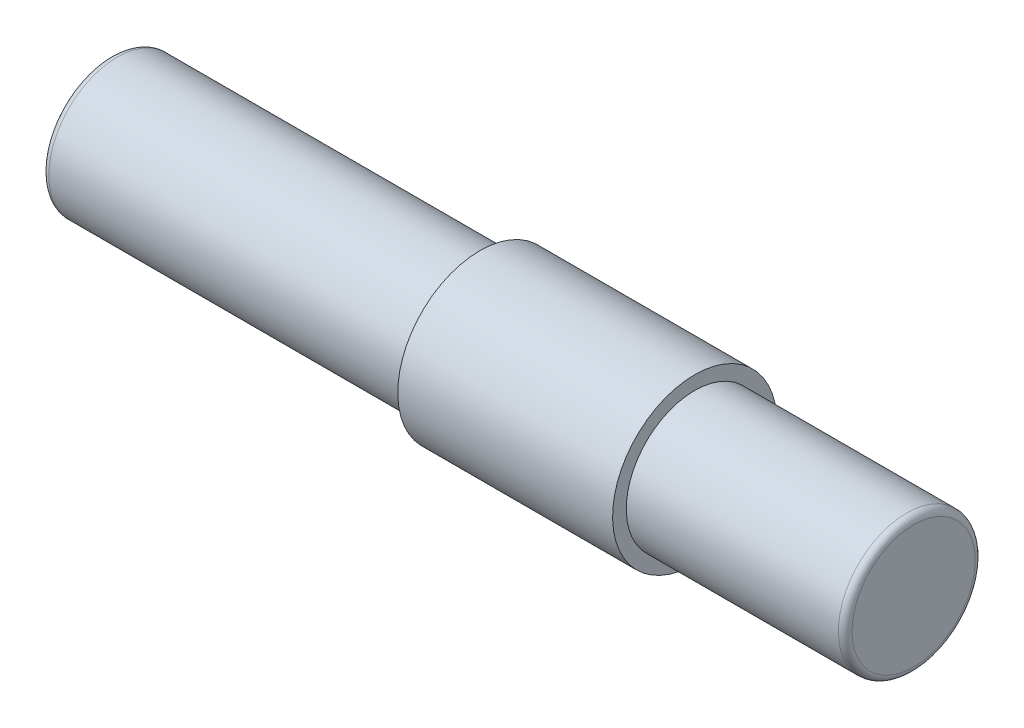
ISO-10303-21;
HEADER;
FILE_DESCRIPTION(('STEP AP214'),'2;1');
FILE_NAME('part.step','',(''),(''),'','','');
FILE_SCHEMA(('AUTOMOTIVE_DESIGN { 1 0 10303 214 1 1 1 1 }'));
ENDSEC;
DATA;
#1=APPLICATION_CONTEXT('core data for automotive mechanical design processes');
#2=APPLICATION_PROTOCOL_DEFINITION('international standard','automotive_design',2000,#1);
#3=PRODUCT_CONTEXT('',#1,'mechanical');
#4=PRODUCT('Part','Part','',(#3));
#5=PRODUCT_RELATED_PRODUCT_CATEGORY('part','',(#4));
#6=PRODUCT_DEFINITION_FORMATION('','',#4);
#7=PRODUCT_DEFINITION_CONTEXT('part definition',#1,'design');
#8=PRODUCT_DEFINITION('design','',#6,#7);
#9=PRODUCT_DEFINITION_SHAPE('','',#8);
#10=(LENGTH_UNIT() NAMED_UNIT(*) SI_UNIT(.MILLI.,.METRE.));
#11=(NAMED_UNIT(*) PLANE_ANGLE_UNIT() SI_UNIT($,.RADIAN.));
#12=(NAMED_UNIT(*) SI_UNIT($,.STERADIAN.) SOLID_ANGLE_UNIT());
#13=UNCERTAINTY_MEASURE_WITH_UNIT(LENGTH_MEASURE(1.E-05),#10,'distance_accuracy_value','');
#14=(GEOMETRIC_REPRESENTATION_CONTEXT(3) GLOBAL_UNCERTAINTY_ASSIGNED_CONTEXT((#13)) GLOBAL_UNIT_ASSIGNED_CONTEXT((#10,
#11,#12)) REPRESENTATION_CONTEXT('',''));
#15=CARTESIAN_POINT('',(0.,0.,0.));
#16=DIRECTION('',(0.,0.,1.));
#17=DIRECTION('',(1.,0.,0.));
#18=AXIS2_PLACEMENT_3D('',#15,#16,#17);
#19=CARTESIAN_POINT('',(-78.7780779732345,1.7543788122043,0.));
#20=DIRECTION('',(-1.,0.,0.));
#21=DIRECTION('',(0.,-1.,0.));
#22=AXIS2_PLACEMENT_3D('',#19,#20,#21);
#23=PLANE('',#22);
#24=CARTESIAN_POINT('',(-78.7780779732345,1.7543788122043,0.));
#25=DIRECTION('',(-1.,0.,0.));
#26=DIRECTION('',(0.,-1.,0.));
#27=AXIS2_PLACEMENT_3D('',#24,#25,#26);
#28=CIRCLE('',#27,4.5);
#29=CARTESIAN_POINT('',(-78.7780779732345,-2.74562118779569,0.));
#30=VERTEX_POINT('',#29);
#31=EDGE_CURVE('E10',#30,#30,#28,.T.);
#32=ORIENTED_EDGE('',*,*,#31,.T.);
#33=EDGE_LOOP('',(#32));
#34=FACE_BOUND('',#33,.T.);
#35=ADVANCED_FACE('F32',(#34),#23,.T.);
#36=CARTESIAN_POINT('',(-20.0780779732345,1.75437881220431,0.));
#37=DIRECTION('',(1.,0.,0.));
#38=DIRECTION('',(0.,1.,0.));
#39=AXIS2_PLACEMENT_3D('',#36,#37,#38);
#40=CYLINDRICAL_SURFACE('',#39,5.);
#41=CARTESIAN_POINT('',(-78.2780779732345,1.7543788122043,0.));
#42=DIRECTION('',(-1.,0.,0.));
#43=DIRECTION('',(0.,-1.,0.));
#44=AXIS2_PLACEMENT_3D('',#41,#42,#43);
#45=CIRCLE('',#44,5.);
#46=CARTESIAN_POINT('',(-78.2780779732345,-3.24562118779569,0.));
#47=VERTEX_POINT('',#46);
#48=EDGE_CURVE('E39',#47,#47,#45,.F.);
#49=ORIENTED_EDGE('',*,*,#48,.T.);
#50=EDGE_LOOP('',(#49));
#51=FACE_BOUND('',#50,.T.);
#52=CARTESIAN_POINT('',(-51.7780779732345,1.75437881220431,0.));
#53=DIRECTION('',(1.,0.,0.));
#54=DIRECTION('',(0.,1.,0.));
#55=AXIS2_PLACEMENT_3D('',#52,#53,#54);
#56=CIRCLE('',#55,5.);
#57=CARTESIAN_POINT('',(-51.7780779732345,6.7543788122043,0.));
#58=VERTEX_POINT('',#57);
#59=EDGE_CURVE('E52',#58,#58,#56,.T.);
#60=ORIENTED_EDGE('',*,*,#59,.F.);
#61=EDGE_LOOP('',(#60));
#62=FACE_BOUND('',#61,.T.);
#63=ADVANCED_FACE('F83',(#51,#62),#40,.T.);
#64=CARTESIAN_POINT('',(-51.7780779732345,6.7543788122043,0.));
#65=DIRECTION('',(-1.,0.,0.));
#66=DIRECTION('',(0.,-1.,0.));
#67=AXIS2_PLACEMENT_3D('',#64,#65,#66);
#68=PLANE('',#67);
#69=ORIENTED_EDGE('',*,*,#59,.T.);
#70=EDGE_LOOP('',(#69));
#71=FACE_BOUND('',#70,.T.);
#72=CARTESIAN_POINT('',(-51.7780779732345,1.75437881220431,0.));
#73=DIRECTION('',(1.,0.,0.));
#74=DIRECTION('',(0.,1.,0.));
#75=AXIS2_PLACEMENT_3D('',#72,#73,#74);
#76=CIRCLE('',#75,6.);
#77=CARTESIAN_POINT('',(-51.7780779732345,7.75437881220431,0.));
#78=VERTEX_POINT('',#77);
#79=EDGE_CURVE('E55',#78,#78,#76,.T.);
#80=ORIENTED_EDGE('',*,*,#79,.F.);
#81=EDGE_LOOP('',(#80));
#82=FACE_BOUND('',#81,.T.);
#83=ADVANCED_FACE('F79',(#71,#82),#68,.T.);
#84=CARTESIAN_POINT('',(-20.0780779732345,1.75437881220431,0.));
#85=DIRECTION('',(1.,0.,0.));
#86=DIRECTION('',(0.,1.,0.));
#87=AXIS2_PLACEMENT_3D('',#84,#85,#86);
#88=CYLINDRICAL_SURFACE('',#87,6.);
#89=ORIENTED_EDGE('',*,*,#79,.T.);
#90=EDGE_LOOP('',(#89));
#91=FACE_BOUND('',#90,.T.);
#92=CARTESIAN_POINT('',(-36.0780779732345,1.75437881220431,0.));
#93=DIRECTION('',(1.,0.,0.));
#94=DIRECTION('',(0.,1.,0.));
#95=AXIS2_PLACEMENT_3D('',#92,#93,#94);
#96=CIRCLE('',#95,6.);
#97=CARTESIAN_POINT('',(-36.0780779732345,7.75437881220431,0.));
#98=VERTEX_POINT('',#97);
#99=EDGE_CURVE('E58',#98,#98,#96,.T.);
#100=ORIENTED_EDGE('',*,*,#99,.F.);
#101=EDGE_LOOP('',(#100));
#102=FACE_BOUND('',#101,.T.);
#103=ADVANCED_FACE('F69',(#91,#102),#88,.T.);
#104=CARTESIAN_POINT('',(-36.0780779732345,7.75437881220431,0.));
#105=DIRECTION('',(1.,0.,0.));
#106=DIRECTION('',(0.,1.,0.));
#107=AXIS2_PLACEMENT_3D('',#104,#105,#106);
#108=PLANE('',#107);
#109=ORIENTED_EDGE('',*,*,#99,.T.);
#110=EDGE_LOOP('',(#109));
#111=FACE_BOUND('',#110,.T.);
#112=CARTESIAN_POINT('',(-36.0780779732345,1.75437881220431,0.));
#113=DIRECTION('',(1.,0.,0.));
#114=DIRECTION('',(0.,1.,0.));
#115=AXIS2_PLACEMENT_3D('',#112,#113,#114);
#116=CIRCLE('',#115,5.);
#117=CARTESIAN_POINT('',(-36.0780779732345,6.75437881220431,0.));
#118=VERTEX_POINT('',#117);
#119=EDGE_CURVE('E61',#118,#118,#116,.T.);
#120=ORIENTED_EDGE('',*,*,#119,.F.);
#121=EDGE_LOOP('',(#120));
#122=FACE_BOUND('',#121,.T.);
#123=ADVANCED_FACE('F67',(#111,#122),#108,.T.);
#124=CARTESIAN_POINT('',(-20.0780779732345,1.75437881220431,0.));
#125=DIRECTION('',(1.,0.,0.));
#126=DIRECTION('',(0.,1.,0.));
#127=AXIS2_PLACEMENT_3D('',#124,#125,#126);
#128=CYLINDRICAL_SURFACE('',#127,4.99999999999999);
#129=CARTESIAN_POINT('',(-20.5780779732345,1.75437881220431,0.));
#130=DIRECTION('',(1.,0.,0.));
#131=DIRECTION('',(0.,1.,0.));
#132=AXIS2_PLACEMENT_3D('',#129,#130,#131);
#133=CIRCLE('',#132,4.99999999999999);
#134=CARTESIAN_POINT('',(-20.5780779732345,6.7543788122043,0.));
#135=VERTEX_POINT('',#134);
#136=EDGE_CURVE('E43',#135,#135,#133,.F.);
#137=ORIENTED_EDGE('',*,*,#136,.T.);
#138=EDGE_LOOP('',(#137));
#139=FACE_BOUND('',#138,.T.);
#140=ORIENTED_EDGE('',*,*,#119,.T.);
#141=EDGE_LOOP('',(#140));
#142=FACE_BOUND('',#141,.T.);
#143=ADVANCED_FACE('F65',(#139,#142),#128,.T.);
#144=CARTESIAN_POINT('',(-20.0780779732345,6.75437881220431,0.));
#145=DIRECTION('',(1.,0.,0.));
#146=DIRECTION('',(0.,1.,0.));
#147=AXIS2_PLACEMENT_3D('',#144,#145,#146);
#148=PLANE('',#147);
#149=CARTESIAN_POINT('',(-20.0780779732345,1.75437881220431,0.));
#150=DIRECTION('',(1.,0.,0.));
#151=DIRECTION('',(0.,1.,0.));
#152=AXIS2_PLACEMENT_3D('',#149,#150,#151);
#153=CIRCLE('',#152,4.49999999999999);
#154=CARTESIAN_POINT('',(-20.0780779732345,6.2543788122043,0.));
#155=VERTEX_POINT('',#154);
#156=EDGE_CURVE('E47',#155,#155,#153,.T.);
#157=ORIENTED_EDGE('',*,*,#156,.T.);
#158=EDGE_LOOP('',(#157));
#159=FACE_BOUND('',#158,.T.);
#160=ADVANCED_FACE('F76',(#159),#148,.T.);
#161=CARTESIAN_POINT('',(-20.5780779732345,1.75437881220431,0.));
#162=DIRECTION('',(1.,0.,0.));
#163=DIRECTION('',(0.,1.,0.));
#164=AXIS2_PLACEMENT_3D('',#161,#162,#163);
#165=TOROIDAL_SURFACE('',#164,4.49999999999999,0.5);
#166=ORIENTED_EDGE('',*,*,#136,.F.);
#167=EDGE_LOOP('',(#166));
#168=FACE_BOUND('',#167,.T.);
#169=ORIENTED_EDGE('',*,*,#156,.F.);
#170=EDGE_LOOP('',(#169));
#171=FACE_BOUND('',#170,.T.);
#172=ADVANCED_FACE('F90',(#168,#171),#165,.T.);
#173=CARTESIAN_POINT('',(-78.2780779732345,1.7543788122043,0.));
#174=DIRECTION('',(-1.,0.,0.));
#175=DIRECTION('',(0.,-1.,0.));
#176=AXIS2_PLACEMENT_3D('',#173,#174,#175);
#177=TOROIDAL_SURFACE('',#176,4.5,0.5);
#178=ORIENTED_EDGE('',*,*,#31,.F.);
#179=EDGE_LOOP('',(#178));
#180=FACE_BOUND('',#179,.T.);
#181=ORIENTED_EDGE('',*,*,#48,.F.);
#182=EDGE_LOOP('',(#181));
#183=FACE_BOUND('',#182,.T.);
#184=ADVANCED_FACE('F34',(#180,#183),#177,.T.);
#185=CLOSED_SHELL('',(#35,#63,#83,#103,#123,#143,#160,#172,#184));
#186=MANIFOLD_SOLID_BREP('B2',#185);
#187=ADVANCED_BREP_SHAPE_REPRESENTATION('',(#18,#186),#14);
#188=SHAPE_DEFINITION_REPRESENTATION(#9,#187);
ENDSEC;
END-ISO-10303-21;
